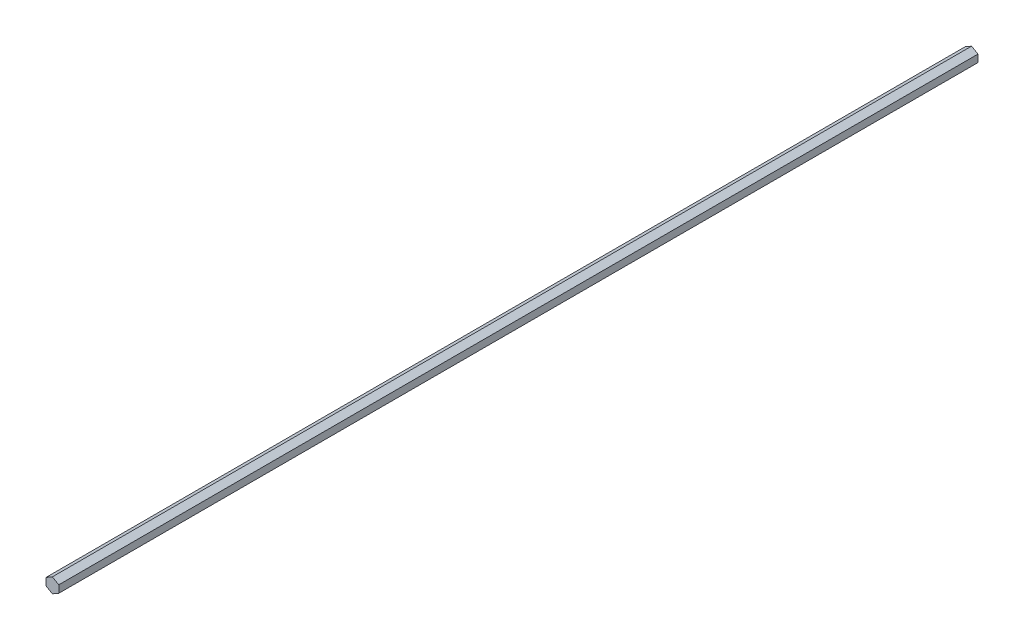
ISO-10303-21;
HEADER;
FILE_DESCRIPTION(('STEP AP214'),'2;1');
FILE_NAME('part.step','',(''),(''),'','','');
FILE_SCHEMA(('AUTOMOTIVE_DESIGN { 1 0 10303 214 1 1 1 1 }'));
ENDSEC;
DATA;
#1=APPLICATION_CONTEXT('core data for automotive mechanical design processes');
#2=APPLICATION_PROTOCOL_DEFINITION('international standard','automotive_design',2000,#1);
#3=PRODUCT_CONTEXT('',#1,'mechanical');
#4=PRODUCT('Part','Part','',(#3));
#5=PRODUCT_RELATED_PRODUCT_CATEGORY('part','',(#4));
#6=PRODUCT_DEFINITION_FORMATION('','',#4);
#7=PRODUCT_DEFINITION_CONTEXT('part definition',#1,'design');
#8=PRODUCT_DEFINITION('design','',#6,#7);
#9=PRODUCT_DEFINITION_SHAPE('','',#8);
#10=(LENGTH_UNIT() NAMED_UNIT(*) SI_UNIT(.MILLI.,.METRE.));
#11=(NAMED_UNIT(*) PLANE_ANGLE_UNIT() SI_UNIT($,.RADIAN.));
#12=(NAMED_UNIT(*) SI_UNIT($,.STERADIAN.) SOLID_ANGLE_UNIT());
#13=UNCERTAINTY_MEASURE_WITH_UNIT(LENGTH_MEASURE(1.E-05),#10,'distance_accuracy_value','');
#14=(GEOMETRIC_REPRESENTATION_CONTEXT(3) GLOBAL_UNCERTAINTY_ASSIGNED_CONTEXT((#13)) GLOBAL_UNIT_ASSIGNED_CONTEXT((#10,
#11,#12)) REPRESENTATION_CONTEXT('',''));
#15=CARTESIAN_POINT('',(0.,0.,0.));
#16=DIRECTION('',(0.,0.,1.));
#17=DIRECTION('',(1.,0.,0.));
#18=AXIS2_PLACEMENT_3D('',#15,#16,#17);
#19=CARTESIAN_POINT('',(-6.35,3.66617420935411,457.2));
#20=DIRECTION('',(1.,0.,0.));
#21=DIRECTION('',(0.,0.,-1.));
#22=AXIS2_PLACEMENT_3D('',#19,#20,#21);
#23=PLANE('',#22);
#24=DIRECTION('',(0.,0.,-1.));
#25=VECTOR('',#24,1.);
#26=CARTESIAN_POINT('',(-6.35,3.66617420935411,457.2));
#27=LINE('',#26,#25);
#28=CARTESIAN_POINT('',(-6.35,3.66617420935411,457.2));
#29=VERTEX_POINT('',#28);
#30=CARTESIAN_POINT('',(-6.35,3.66617420935411,-457.2));
#31=VERTEX_POINT('',#30);
#32=EDGE_CURVE('E102',#29,#31,#27,.T.);
#33=ORIENTED_EDGE('',*,*,#32,.T.);
#34=DIRECTION('',(0.,-1.,0.));
#35=VECTOR('',#34,1.);
#36=CARTESIAN_POINT('',(-6.35,3.66617420935411,-457.2));
#37=LINE('',#36,#35);
#38=CARTESIAN_POINT('',(-6.35,-3.66617420935413,-457.2));
#39=VERTEX_POINT('',#38);
#40=EDGE_CURVE('E96',#31,#39,#37,.T.);
#41=ORIENTED_EDGE('',*,*,#40,.T.);
#42=DIRECTION('',(0.,0.,-1.));
#43=VECTOR('',#42,1.);
#44=CARTESIAN_POINT('',(-6.35,-3.66617420935413,457.2));
#45=LINE('',#44,#43);
#46=CARTESIAN_POINT('',(-6.35,-3.66617420935413,457.2));
#47=VERTEX_POINT('',#46);
#48=EDGE_CURVE('E11',#47,#39,#45,.T.);
#49=ORIENTED_EDGE('',*,*,#48,.F.);
#50=DIRECTION('',(0.,-1.,0.));
#51=VECTOR('',#50,1.);
#52=CARTESIAN_POINT('',(-6.35,3.66617420935411,457.2));
#53=LINE('',#52,#51);
#54=EDGE_CURVE('E114',#29,#47,#53,.T.);
#55=ORIENTED_EDGE('',*,*,#54,.F.);
#56=EDGE_LOOP('',(#33,#41,#49,#55));
#57=FACE_BOUND('',#56,.T.);
#58=ADVANCED_FACE('F32',(#57),#23,.F.);
#59=CARTESIAN_POINT('',(-6.35,-3.66617420935413,457.2));
#60=DIRECTION('',(0.5,0.866025403784439,0.));
#61=DIRECTION('',(-0.866025403784439,0.5,0.));
#62=AXIS2_PLACEMENT_3D('',#59,#60,#61);
#63=PLANE('',#62);
#64=ORIENTED_EDGE('',*,*,#48,.T.);
#65=DIRECTION('',(0.866025403784439,-0.5,0.));
#66=VECTOR('',#65,1.);
#67=CARTESIAN_POINT('',(-6.35,-3.66617420935413,-457.2));
#68=LINE('',#67,#66);
#69=CARTESIAN_POINT('',(0.,-7.33234841870826,-457.2));
#70=VERTEX_POINT('',#69);
#71=EDGE_CURVE('E86',#39,#70,#68,.T.);
#72=ORIENTED_EDGE('',*,*,#71,.T.);
#73=DIRECTION('',(0.,0.,-1.));
#74=VECTOR('',#73,1.);
#75=CARTESIAN_POINT('',(0.,-7.33234841870826,457.2));
#76=LINE('',#75,#74);
#77=CARTESIAN_POINT('',(0.,-7.33234841870826,457.2));
#78=VERTEX_POINT('',#77);
#79=EDGE_CURVE('E39',#78,#70,#76,.T.);
#80=ORIENTED_EDGE('',*,*,#79,.F.);
#81=DIRECTION('',(0.866025403784439,-0.5,0.));
#82=VECTOR('',#81,1.);
#83=CARTESIAN_POINT('',(-6.35,-3.66617420935413,457.2));
#84=LINE('',#83,#82);
#85=EDGE_CURVE('E87',#47,#78,#84,.T.);
#86=ORIENTED_EDGE('',*,*,#85,.F.);
#87=EDGE_LOOP('',(#64,#72,#80,#86));
#88=FACE_BOUND('',#87,.T.);
#89=ADVANCED_FACE('F84',(#88),#63,.F.);
#90=CARTESIAN_POINT('',(0.,-7.33234841870826,457.2));
#91=DIRECTION('',(-0.5,0.866025403784439,0.));
#92=DIRECTION('',(-0.866025403784439,-0.5,0.));
#93=AXIS2_PLACEMENT_3D('',#90,#91,#92);
#94=PLANE('',#93);
#95=ORIENTED_EDGE('',*,*,#79,.T.);
#96=DIRECTION('',(0.866025403784439,0.5,0.));
#97=VECTOR('',#96,1.);
#98=CARTESIAN_POINT('',(0.,-7.33234841870826,-457.2));
#99=LINE('',#98,#97);
#100=CARTESIAN_POINT('',(6.35,-3.66617420935414,-457.2));
#101=VERTEX_POINT('',#100);
#102=EDGE_CURVE('E100',#70,#101,#99,.T.);
#103=ORIENTED_EDGE('',*,*,#102,.T.);
#104=DIRECTION('',(0.,0.,-1.));
#105=VECTOR('',#104,1.);
#106=CARTESIAN_POINT('',(6.35,-3.66617420935414,457.2));
#107=LINE('',#106,#105);
#108=CARTESIAN_POINT('',(6.35,-3.66617420935414,457.2));
#109=VERTEX_POINT('',#108);
#110=EDGE_CURVE('E128',#109,#101,#107,.T.);
#111=ORIENTED_EDGE('',*,*,#110,.F.);
#112=DIRECTION('',(0.866025403784439,0.5,0.));
#113=VECTOR('',#112,1.);
#114=CARTESIAN_POINT('',(0.,-7.33234841870826,457.2));
#115=LINE('',#114,#113);
#116=EDGE_CURVE('E117',#78,#109,#115,.T.);
#117=ORIENTED_EDGE('',*,*,#116,.F.);
#118=EDGE_LOOP('',(#95,#103,#111,#117));
#119=FACE_BOUND('',#118,.T.);
#120=ADVANCED_FACE('F131',(#119),#94,.F.);
#121=CARTESIAN_POINT('',(6.35,-3.66617420935414,457.2));
#122=DIRECTION('',(-1.,0.,0.));
#123=DIRECTION('',(0.,-1.,0.));
#124=AXIS2_PLACEMENT_3D('',#121,#122,#123);
#125=PLANE('',#124);
#126=ORIENTED_EDGE('',*,*,#110,.T.);
#127=DIRECTION('',(0.,1.,0.));
#128=VECTOR('',#127,1.);
#129=CARTESIAN_POINT('',(6.35,-3.66617420935414,-457.2));
#130=LINE('',#129,#128);
#131=CARTESIAN_POINT('',(6.35,3.66617420935412,-457.2));
#132=VERTEX_POINT('',#131);
#133=EDGE_CURVE('E106',#101,#132,#130,.T.);
#134=ORIENTED_EDGE('',*,*,#133,.T.);
#135=DIRECTION('',(0.,0.,-1.));
#136=VECTOR('',#135,1.);
#137=CARTESIAN_POINT('',(6.35,3.66617420935412,457.2));
#138=LINE('',#137,#136);
#139=CARTESIAN_POINT('',(6.35,3.66617420935412,457.2));
#140=VERTEX_POINT('',#139);
#141=EDGE_CURVE('E126',#140,#132,#138,.T.);
#142=ORIENTED_EDGE('',*,*,#141,.F.);
#143=DIRECTION('',(0.,1.,0.));
#144=VECTOR('',#143,1.);
#145=CARTESIAN_POINT('',(6.35,-3.66617420935414,457.2));
#146=LINE('',#145,#144);
#147=EDGE_CURVE('E119',#109,#140,#146,.T.);
#148=ORIENTED_EDGE('',*,*,#147,.F.);
#149=EDGE_LOOP('',(#126,#134,#142,#148));
#150=FACE_BOUND('',#149,.T.);
#151=ADVANCED_FACE('F137',(#150),#125,.F.);
#152=CARTESIAN_POINT('',(6.35,3.66617420935412,457.2));
#153=DIRECTION('',(-0.5,-0.866025403784439,0.));
#154=DIRECTION('',(0.866025403784439,-0.5,0.));
#155=AXIS2_PLACEMENT_3D('',#152,#153,#154);
#156=PLANE('',#155);
#157=ORIENTED_EDGE('',*,*,#141,.T.);
#158=DIRECTION('',(-0.866025403784439,0.5,0.));
#159=VECTOR('',#158,1.);
#160=CARTESIAN_POINT('',(6.35,3.66617420935412,-457.2));
#161=LINE('',#160,#159);
#162=CARTESIAN_POINT('',(0.,7.33234841870824,-457.2));
#163=VERTEX_POINT('',#162);
#164=EDGE_CURVE('E109',#132,#163,#161,.T.);
#165=ORIENTED_EDGE('',*,*,#164,.T.);
#166=DIRECTION('',(0.,0.,-1.));
#167=VECTOR('',#166,1.);
#168=CARTESIAN_POINT('',(0.,7.33234841870824,457.2));
#169=LINE('',#168,#167);
#170=CARTESIAN_POINT('',(0.,7.33234841870824,457.2));
#171=VERTEX_POINT('',#170);
#172=EDGE_CURVE('E124',#171,#163,#169,.T.);
#173=ORIENTED_EDGE('',*,*,#172,.F.);
#174=DIRECTION('',(-0.866025403784439,0.5,0.));
#175=VECTOR('',#174,1.);
#176=CARTESIAN_POINT('',(6.35,3.66617420935412,457.2));
#177=LINE('',#176,#175);
#178=EDGE_CURVE('E51',#140,#171,#177,.T.);
#179=ORIENTED_EDGE('',*,*,#178,.F.);
#180=EDGE_LOOP('',(#157,#165,#173,#179));
#181=FACE_BOUND('',#180,.T.);
#182=ADVANCED_FACE('F140',(#181),#156,.F.);
#183=CARTESIAN_POINT('',(0.,7.33234841870824,457.2));
#184=DIRECTION('',(0.5,-0.866025403784439,0.));
#185=DIRECTION('',(0.866025403784439,0.5,0.));
#186=AXIS2_PLACEMENT_3D('',#183,#184,#185);
#187=PLANE('',#186);
#188=ORIENTED_EDGE('',*,*,#172,.T.);
#189=DIRECTION('',(-0.866025403784439,-0.5,0.));
#190=VECTOR('',#189,1.);
#191=CARTESIAN_POINT('',(0.,7.33234841870824,-457.2));
#192=LINE('',#191,#190);
#193=EDGE_CURVE('E112',#163,#31,#192,.T.);
#194=ORIENTED_EDGE('',*,*,#193,.T.);
#195=ORIENTED_EDGE('',*,*,#32,.F.);
#196=DIRECTION('',(-0.866025403784439,-0.5,0.));
#197=VECTOR('',#196,1.);
#198=CARTESIAN_POINT('',(0.,7.33234841870824,457.2));
#199=LINE('',#198,#197);
#200=EDGE_CURVE('E46',#171,#29,#199,.T.);
#201=ORIENTED_EDGE('',*,*,#200,.F.);
#202=EDGE_LOOP('',(#188,#194,#195,#201));
#203=FACE_BOUND('',#202,.T.);
#204=ADVANCED_FACE('F142',(#203),#187,.F.);
#205=CARTESIAN_POINT('',(0.,0.,457.2));
#206=DIRECTION('',(0.,0.,1.));
#207=DIRECTION('',(1.,0.,0.));
#208=AXIS2_PLACEMENT_3D('',#205,#206,#207);
#209=PLANE('',#208);
#210=ORIENTED_EDGE('',*,*,#54,.T.);
#211=ORIENTED_EDGE('',*,*,#85,.T.);
#212=ORIENTED_EDGE('',*,*,#116,.T.);
#213=ORIENTED_EDGE('',*,*,#147,.T.);
#214=ORIENTED_EDGE('',*,*,#178,.T.);
#215=ORIENTED_EDGE('',*,*,#200,.T.);
#216=EDGE_LOOP('',(#210,#211,#212,#213,#214,#215));
#217=FACE_BOUND('',#216,.T.);
#218=ADVANCED_FACE('F134',(#217),#209,.T.);
#219=CARTESIAN_POINT('',(0.,0.,-457.2));
#220=DIRECTION('',(0.,0.,1.));
#221=DIRECTION('',(1.,0.,0.));
#222=AXIS2_PLACEMENT_3D('',#219,#220,#221);
#223=PLANE('',#222);
#224=ORIENTED_EDGE('',*,*,#40,.F.);
#225=ORIENTED_EDGE('',*,*,#193,.F.);
#226=ORIENTED_EDGE('',*,*,#164,.F.);
#227=ORIENTED_EDGE('',*,*,#133,.F.);
#228=ORIENTED_EDGE('',*,*,#102,.F.);
#229=ORIENTED_EDGE('',*,*,#71,.F.);
#230=EDGE_LOOP('',(#224,#225,#226,#227,#228,#229));
#231=FACE_BOUND('',#230,.T.);
#232=ADVANCED_FACE('F94',(#231),#223,.F.);
#233=CLOSED_SHELL('',(#58,#89,#120,#151,#182,#204,#218,#232));
#234=MANIFOLD_SOLID_BREP('B2',#233);
#235=ADVANCED_BREP_SHAPE_REPRESENTATION('',(#18,#234),#14);
#236=SHAPE_DEFINITION_REPRESENTATION(#9,#235);
ENDSEC;
END-ISO-10303-21;
